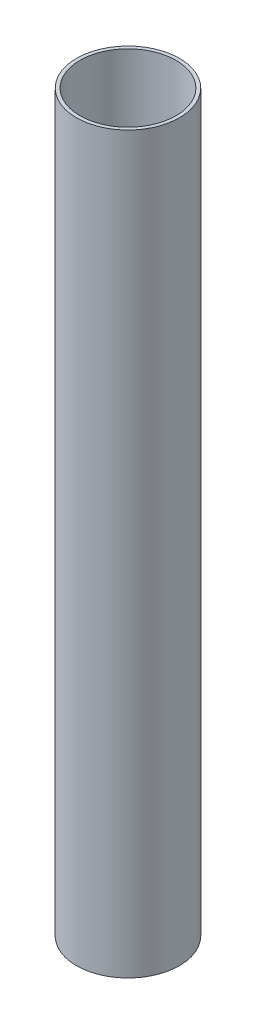
ISO-10303-21;
HEADER;
FILE_DESCRIPTION(('STEP AP214'),'2;1');
FILE_NAME('part.step','',(''),(''),'','','');
FILE_SCHEMA(('AUTOMOTIVE_DESIGN { 1 0 10303 214 1 1 1 1 }'));
ENDSEC;
DATA;
#1=APPLICATION_CONTEXT('core data for automotive mechanical design processes');
#2=APPLICATION_PROTOCOL_DEFINITION('international standard','automotive_design',2000,#1);
#3=PRODUCT_CONTEXT('',#1,'mechanical');
#4=PRODUCT('Part','Part','',(#3));
#5=PRODUCT_RELATED_PRODUCT_CATEGORY('part','',(#4));
#6=PRODUCT_DEFINITION_FORMATION('','',#4);
#7=PRODUCT_DEFINITION_CONTEXT('part definition',#1,'design');
#8=PRODUCT_DEFINITION('design','',#6,#7);
#9=PRODUCT_DEFINITION_SHAPE('','',#8);
#10=(LENGTH_UNIT() NAMED_UNIT(*) SI_UNIT(.MILLI.,.METRE.));
#11=(NAMED_UNIT(*) PLANE_ANGLE_UNIT() SI_UNIT($,.RADIAN.));
#12=(NAMED_UNIT(*) SI_UNIT($,.STERADIAN.) SOLID_ANGLE_UNIT());
#13=UNCERTAINTY_MEASURE_WITH_UNIT(LENGTH_MEASURE(1.E-05),#10,'distance_accuracy_value','');
#14=(GEOMETRIC_REPRESENTATION_CONTEXT(3) GLOBAL_UNCERTAINTY_ASSIGNED_CONTEXT((#13)) GLOBAL_UNIT_ASSIGNED_CONTEXT((#10,
#11,#12)) REPRESENTATION_CONTEXT('',''));
#15=CARTESIAN_POINT('',(0.,0.,0.));
#16=DIRECTION('',(0.,0.,1.));
#17=DIRECTION('',(1.,0.,0.));
#18=AXIS2_PLACEMENT_3D('',#15,#16,#17);
#19=CARTESIAN_POINT('',(0.,702.056,0.));
#20=DIRECTION('',(0.,1.,0.));
#21=DIRECTION('',(0.,0.,1.));
#22=AXIS2_PLACEMENT_3D('',#19,#20,#21);
#23=PLANE('',#22);
#24=CARTESIAN_POINT('',(0.,702.056,0.));
#25=DIRECTION('',(0.,1.,0.));
#26=DIRECTION('',(0.,0.,1.));
#27=AXIS2_PLACEMENT_3D('',#24,#25,#26);
#28=CIRCLE('',#27,49.2125);
#29=CARTESIAN_POINT('',(0.,702.056,49.2125));
#30=VERTEX_POINT('',#29);
#31=EDGE_CURVE('E10',#30,#30,#28,.T.);
#32=ORIENTED_EDGE('',*,*,#31,.T.);
#33=EDGE_LOOP('',(#32));
#34=FACE_BOUND('',#33,.T.);
#35=CARTESIAN_POINT('',(0.,702.056,0.));
#36=DIRECTION('',(0.,1.,0.));
#37=DIRECTION('',(0.,0.,1.));
#38=AXIS2_PLACEMENT_3D('',#35,#36,#37);
#39=CIRCLE('',#38,45.9359);
#40=CARTESIAN_POINT('',(0.,702.056,45.9359));
#41=VERTEX_POINT('',#40);
#42=EDGE_CURVE('E46',#41,#41,#39,.T.);
#43=ORIENTED_EDGE('',*,*,#42,.F.);
#44=EDGE_LOOP('',(#43));
#45=FACE_BOUND('',#44,.T.);
#46=ADVANCED_FACE('F35',(#34,#45),#23,.T.);
#47=CARTESIAN_POINT('',(0.,0.,0.));
#48=DIRECTION('',(0.,1.,0.));
#49=DIRECTION('',(0.,0.,1.));
#50=AXIS2_PLACEMENT_3D('',#47,#48,#49);
#51=PLANE('',#50);
#52=CARTESIAN_POINT('',(0.,0.,0.));
#53=DIRECTION('',(0.,1.,0.));
#54=DIRECTION('',(0.,0.,1.));
#55=AXIS2_PLACEMENT_3D('',#52,#53,#54);
#56=CIRCLE('',#55,49.2125);
#57=CARTESIAN_POINT('',(0.,0.,49.2125));
#58=VERTEX_POINT('',#57);
#59=EDGE_CURVE('E39',#58,#58,#56,.T.);
#60=ORIENTED_EDGE('',*,*,#59,.F.);
#61=EDGE_LOOP('',(#60));
#62=FACE_BOUND('',#61,.T.);
#63=CARTESIAN_POINT('',(0.,0.,0.));
#64=DIRECTION('',(0.,1.,0.));
#65=DIRECTION('',(0.,0.,1.));
#66=AXIS2_PLACEMENT_3D('',#63,#64,#65);
#67=CIRCLE('',#66,45.9359);
#68=CARTESIAN_POINT('',(0.,0.,45.9359));
#69=VERTEX_POINT('',#68);
#70=EDGE_CURVE('E48',#69,#69,#67,.T.);
#71=ORIENTED_EDGE('',*,*,#70,.T.);
#72=EDGE_LOOP('',(#71));
#73=FACE_BOUND('',#72,.T.);
#74=ADVANCED_FACE('F58',(#62,#73),#51,.F.);
#75=CARTESIAN_POINT('',(0.,702.056,0.));
#76=DIRECTION('',(0.,-1.,0.));
#77=DIRECTION('',(0.,0.,-1.));
#78=AXIS2_PLACEMENT_3D('',#75,#76,#77);
#79=CYLINDRICAL_SURFACE('',#78,49.2125);
#80=ORIENTED_EDGE('',*,*,#31,.F.);
#81=EDGE_LOOP('',(#80));
#82=FACE_BOUND('',#81,.T.);
#83=ORIENTED_EDGE('',*,*,#59,.T.);
#84=EDGE_LOOP('',(#83));
#85=FACE_BOUND('',#84,.T.);
#86=ADVANCED_FACE('F37',(#82,#85),#79,.T.);
#87=CARTESIAN_POINT('',(0.,702.056,0.));
#88=DIRECTION('',(0.,-1.,0.));
#89=DIRECTION('',(0.,0.,-1.));
#90=AXIS2_PLACEMENT_3D('',#87,#88,#89);
#91=CYLINDRICAL_SURFACE('',#90,45.9359);
#92=ORIENTED_EDGE('',*,*,#42,.T.);
#93=EDGE_LOOP('',(#92));
#94=FACE_BOUND('',#93,.T.);
#95=ORIENTED_EDGE('',*,*,#70,.F.);
#96=EDGE_LOOP('',(#95));
#97=FACE_BOUND('',#96,.T.);
#98=ADVANCED_FACE('F54',(#94,#97),#91,.F.);
#99=CLOSED_SHELL('',(#46,#74,#86,#98));
#100=MANIFOLD_SOLID_BREP('B2',#99);
#101=ADVANCED_BREP_SHAPE_REPRESENTATION('',(#18,#100),#14);
#102=SHAPE_DEFINITION_REPRESENTATION(#9,#101);
ENDSEC;
END-ISO-10303-21;
